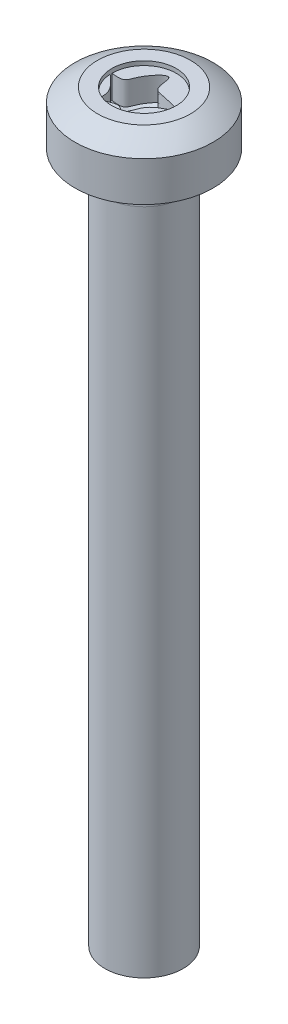
ISO-10303-21;
HEADER;
FILE_DESCRIPTION(('STEP AP214'),'2;1');
FILE_NAME('part.step','',(''),(''),'','','');
FILE_SCHEMA(('AUTOMOTIVE_DESIGN { 1 0 10303 214 1 1 1 1 }'));
ENDSEC;
DATA;
#1=APPLICATION_CONTEXT('core data for automotive mechanical design processes');
#2=APPLICATION_PROTOCOL_DEFINITION('international standard','automotive_design',2000,#1);
#3=PRODUCT_CONTEXT('',#1,'mechanical');
#4=PRODUCT('Part','Part','',(#3));
#5=PRODUCT_RELATED_PRODUCT_CATEGORY('part','',(#4));
#6=PRODUCT_DEFINITION_FORMATION('','',#4);
#7=PRODUCT_DEFINITION_CONTEXT('part definition',#1,'design');
#8=PRODUCT_DEFINITION('design','',#6,#7);
#9=PRODUCT_DEFINITION_SHAPE('','',#8);
#10=(LENGTH_UNIT() NAMED_UNIT(*) SI_UNIT(.MILLI.,.METRE.));
#11=(NAMED_UNIT(*) PLANE_ANGLE_UNIT() SI_UNIT($,.RADIAN.));
#12=(NAMED_UNIT(*) SI_UNIT($,.STERADIAN.) SOLID_ANGLE_UNIT());
#13=UNCERTAINTY_MEASURE_WITH_UNIT(LENGTH_MEASURE(1.E-05),#10,'distance_accuracy_value','');
#14=(GEOMETRIC_REPRESENTATION_CONTEXT(3) GLOBAL_UNCERTAINTY_ASSIGNED_CONTEXT((#13)) GLOBAL_UNIT_ASSIGNED_CONTEXT((#10,
#11,#12)) REPRESENTATION_CONTEXT('',''));
#15=CARTESIAN_POINT('',(0.,0.,0.));
#16=DIRECTION('',(0.,0.,1.));
#17=DIRECTION('',(1.,0.,0.));
#18=AXIS2_PLACEMENT_3D('',#15,#16,#17);
#19=CARTESIAN_POINT('',(-1.39999999999999,62.18,2.42487113059644));
#20=CARTESIAN_POINT('',(-1.5139381572588,62.18,2.3235132192626));
#21=CARTESIAN_POINT('',(-1.29170822303761,62.18,1.05295212978515));
#22=CARTESIAN_POINT('',(-3.73833187546397,62.18,-0.274960193560339));
#23=CARTESIAN_POINT('',(-1.67099433066138,62.18,0.199786237296184));
#24=CARTESIAN_POINT('',(-1.41411817189211,62.18,-1.10647326313669));
#25=CARTESIAN_POINT('',(0.315407203800822,62.18,-3.11761619265361));
#26=CARTESIAN_POINT('',(0.0837874095126002,62.18,-0.75025211345907));
#27=CARTESIAN_POINT('',(1.36584469991785,62.18,-0.443842910863704));
#28=CARTESIAN_POINT('',(3.87744334290299,62.18,-0.00947150733040625));
#29=CARTESIAN_POINT('',(0.884751101149698,62.18,0.553386810394968));
#30=CARTESIAN_POINT('',(0.772921937425964,62.18,2.87320554200612));
#31=CARTESIAN_POINT('',(-0.230343949042386,62.18,1.7651287133654));
#32=CARTESIAN_POINT('',(-1.20531990620942,62.18,2.59805602457418));
#33=CARTESIAN_POINT('',(-1.39999999999999,62.18,2.42487113059644));
#34=B_SPLINE_CURVE_WITH_KNOTS('',3,(#19,#20,#21,#22,#23,#24,#25,#26,#27,#28,#29,#30,#31,#32,
#33),.UNSPECIFIED.,.T.,.F.,(4,1,1,1,1,1,1,1,1,1,1,1,4),(0.,0.0521767829464946,0.179018134340515,
0.237467971194127,0.292040127813916,0.415648105214969,0.507114760558173,0.541693415808289,
0.662364745757282,0.780125533467327,0.878673094989427,0.910848294881233,1.),.UNSPECIFIED.);
#35=DIRECTION('',(0.,1.,0.));
#36=VECTOR('',#35,1.);
#37=SURFACE_OF_LINEAR_EXTRUSION('',#34,#36);
#38=DIRECTION('',(0.,1.,0.));
#39=VECTOR('',#38,1.);
#40=CARTESIAN_POINT('',(-2.79637866927082,62.18,0.142359889179433));
#41=LINE('',#40,#39);
#42=CARTESIAN_POINT('',(-2.79637866927082,62.18,0.142359889179433));
#43=VERTEX_POINT('',#42);
#44=CARTESIAN_POINT('',(-2.79637866927082,64.237,0.142359889179433));
#45=VERTEX_POINT('',#44);
#46=EDGE_CURVE('E146',#43,#45,#41,.T.);
#47=ORIENTED_EDGE('',*,*,#46,.T.);
#48=CARTESIAN_POINT('',(-1.39999999999999,64.237,2.42487113059644));
#49=CARTESIAN_POINT('',(-1.5139381572588,64.237,2.3235132192626));
#50=CARTESIAN_POINT('',(-1.29170822303761,64.237,1.05295212978515));
#51=CARTESIAN_POINT('',(-3.73833187546397,64.237,-0.274960193560339));
#52=CARTESIAN_POINT('',(-1.67099433066138,64.237,0.199786237296184));
#53=CARTESIAN_POINT('',(-1.41411817189211,64.237,-1.10647326313669));
#54=CARTESIAN_POINT('',(0.315407203800822,64.237,-3.11761619265361));
#55=CARTESIAN_POINT('',(0.0837874095126002,64.237,-0.75025211345907));
#56=CARTESIAN_POINT('',(1.36584469991785,64.237,-0.443842910863704));
#57=CARTESIAN_POINT('',(3.87744334290299,64.237,-0.00947150733040625));
#58=CARTESIAN_POINT('',(0.884751101149698,64.237,0.553386810394968));
#59=CARTESIAN_POINT('',(0.772921937425964,64.237,2.87320554200612));
#60=CARTESIAN_POINT('',(-0.230343949042386,64.237,1.7651287133654));
#61=CARTESIAN_POINT('',(-1.20531990620942,64.237,2.59805602457418));
#62=CARTESIAN_POINT('',(-1.39999999999999,64.237,2.42487113059644));
#63=B_SPLINE_CURVE_WITH_KNOTS('',3,(#48,#49,#50,#51,#52,#53,#54,#55,#56,#57,#58,#59,#60,#61,
#62),.UNSPECIFIED.,.T.,.F.,(4,1,1,1,1,1,1,1,1,1,1,1,4),(0.,0.0521767829464946,0.179018134340515,
0.237467971194127,0.292040127813916,0.415648105214969,0.507114760558173,0.541693415808289,
0.662364745757282,0.780125533467327,0.878673094989427,0.910848294881233,1.),.UNSPECIFIED.);
#64=CARTESIAN_POINT('',(-1.39999999999999,64.237,2.42487113059644));
#65=VERTEX_POINT('',#64);
#66=EDGE_CURVE('E126',#45,#65,#63,.F.);
#67=ORIENTED_EDGE('',*,*,#66,.T.);
#68=DIRECTION('',(0.,1.,0.));
#69=VECTOR('',#68,1.);
#70=CARTESIAN_POINT('',(-1.39999999999999,62.18,2.42487113059644));
#71=LINE('',#70,#69);
#72=CARTESIAN_POINT('',(-1.39999999999999,62.18,2.42487113059644));
#73=VERTEX_POINT('',#72);
#74=EDGE_CURVE('E155',#73,#65,#71,.T.);
#75=ORIENTED_EDGE('',*,*,#74,.F.);
#76=CARTESIAN_POINT('',(-1.6622215113609,62.18,1.36969810600984));
#77=VERTEX_POINT('',#76);
#78=EDGE_CURVE('E233',#73,#77,#34,.T.);
#79=ORIENTED_EDGE('',*,*,#78,.T.);
#80=CARTESIAN_POINT('',(-1.8851960611322,62.18,1.04167608474492));
#81=VERTEX_POINT('',#80);
#82=EDGE_CURVE('E239',#77,#81,#34,.T.);
#83=ORIENTED_EDGE('',*,*,#82,.T.);
#84=EDGE_CURVE('E194',#81,#43,#34,.T.);
#85=ORIENTED_EDGE('',*,*,#84,.T.);
#86=EDGE_LOOP('',(#47,#67,#75,#79,#83,#85));
#87=FACE_BOUND('',#86,.T.);
#88=ADVANCED_FACE('F35',(#87),#37,.T.);
#89=DIRECTION('',(0.,1.,0.));
#90=VECTOR('',#89,1.);
#91=CARTESIAN_POINT('',(2.8,62.18,0.));
#92=LINE('',#91,#90);
#93=CARTESIAN_POINT('',(2.8,62.18,0.));
#94=VERTEX_POINT('',#93);
#95=CARTESIAN_POINT('',(2.8,64.237,0.));
#96=VERTEX_POINT('',#95);
#97=EDGE_CURVE('E134',#94,#96,#92,.T.);
#98=ORIENTED_EDGE('',*,*,#97,.T.);
#99=CARTESIAN_POINT('',(-1.39999999999999,64.237,2.42487113059644));
#100=CARTESIAN_POINT('',(-1.5139381572588,64.237,2.3235132192626));
#101=CARTESIAN_POINT('',(-1.29170822303761,64.237,1.05295212978515));
#102=CARTESIAN_POINT('',(-3.73833187546397,64.237,-0.274960193560339));
#103=CARTESIAN_POINT('',(-1.67099433066138,64.237,0.199786237296184));
#104=CARTESIAN_POINT('',(-1.41411817189211,64.237,-1.10647326313669));
#105=CARTESIAN_POINT('',(0.315407203800822,64.237,-3.11761619265361));
#106=CARTESIAN_POINT('',(0.0837874095126002,64.237,-0.75025211345907));
#107=CARTESIAN_POINT('',(1.36584469991785,64.237,-0.443842910863704));
#108=CARTESIAN_POINT('',(3.87744334290299,64.237,-0.00947150733040625));
#109=CARTESIAN_POINT('',(0.884751101149698,64.237,0.553386810394968));
#110=CARTESIAN_POINT('',(0.772921937425964,64.237,2.87320554200612));
#111=CARTESIAN_POINT('',(-0.230343949042386,64.237,1.7651287133654));
#112=CARTESIAN_POINT('',(-1.20531990620942,64.237,2.59805602457418));
#113=CARTESIAN_POINT('',(-1.39999999999999,64.237,2.42487113059644));
#114=B_SPLINE_CURVE_WITH_KNOTS('',3,(#99,#100,#101,#102,#103,#104,#105,#106,#107,#108,#109,#110,
#111,#112,#113),.UNSPECIFIED.,.T.,.F.,(4,1,1,1,1,1,1,1,1,1,1,1,4),(0.,0.0521767829464946,
0.179018134340515,0.237467971194127,0.292040127813916,0.415648105214969,0.507114760558173,
0.541693415808289,0.662364745757282,0.780125533467327,0.878673094989427,0.910848294881233,1.),.UNSPECIFIED.);
#115=CARTESIAN_POINT('',(-2.8,64.237,0.));
#116=VERTEX_POINT('',#115);
#117=EDGE_CURVE('E121',#96,#116,#114,.F.);
#118=ORIENTED_EDGE('',*,*,#117,.T.);
#119=DIRECTION('',(0.,1.,0.));
#120=VECTOR('',#119,1.);
#121=CARTESIAN_POINT('',(-2.8,62.18,0.));
#122=LINE('',#121,#120);
#123=CARTESIAN_POINT('',(-2.8,62.18,0.));
#124=VERTEX_POINT('',#123);
#125=EDGE_CURVE('E137',#124,#116,#122,.T.);
#126=ORIENTED_EDGE('',*,*,#125,.F.);
#127=CARTESIAN_POINT('',(-2.15364801946993,62.18,0.0292140834378174));
#128=VERTEX_POINT('',#127);
#129=EDGE_CURVE('E491',#124,#128,#34,.T.);
#130=ORIENTED_EDGE('',*,*,#129,.T.);
#131=CARTESIAN_POINT('',(-0.348861366704687,62.18,-2.12540560864481));
#132=VERTEX_POINT('',#131);
#133=EDGE_CURVE('E492',#128,#132,#34,.T.);
#134=ORIENTED_EDGE('',*,*,#133,.T.);
#135=CARTESIAN_POINT('',(0.,62.18,-2.15384615384615));
#136=VERTEX_POINT('',#135);
#137=EDGE_CURVE('E494',#132,#136,#34,.T.);
#138=ORIENTED_EDGE('',*,*,#137,.T.);
#139=CARTESIAN_POINT('',(2.13401603917006,62.18,-0.291596980441815));
#140=VERTEX_POINT('',#139);
#141=EDGE_CURVE('E510',#136,#140,#34,.T.);
#142=ORIENTED_EDGE('',*,*,#141,.T.);
#143=EDGE_CURVE('E143',#140,#94,#34,.T.);
#144=ORIENTED_EDGE('',*,*,#143,.T.);
#145=EDGE_LOOP('',(#98,#118,#126,#130,#134,#138,#142,#144));
#146=FACE_BOUND('',#145,.T.);
#147=ADVANCED_FACE('F140',(#146),#37,.T.);
#148=DIRECTION('',(0.,1.,0.));
#149=VECTOR('',#148,1.);
#150=CARTESIAN_POINT('',(-1.35910016824837,62.18,2.44802915274047));
#151=LINE('',#150,#149);
#152=CARTESIAN_POINT('',(-1.35910016824837,62.18,2.44802915274047));
#153=VERTEX_POINT('',#152);
#154=CARTESIAN_POINT('',(-1.35910016824837,64.237,2.44802915274047));
#155=VERTEX_POINT('',#154);
#156=EDGE_CURVE('E149',#153,#155,#151,.T.);
#157=ORIENTED_EDGE('',*,*,#156,.T.);
#158=CARTESIAN_POINT('',(-1.39999999999999,64.237,2.42487113059644));
#159=CARTESIAN_POINT('',(-1.5139381572588,64.237,2.3235132192626));
#160=CARTESIAN_POINT('',(-1.29170822303761,64.237,1.05295212978515));
#161=CARTESIAN_POINT('',(-3.73833187546397,64.237,-0.274960193560339));
#162=CARTESIAN_POINT('',(-1.67099433066138,64.237,0.199786237296184));
#163=CARTESIAN_POINT('',(-1.41411817189211,64.237,-1.10647326313669));
#164=CARTESIAN_POINT('',(0.315407203800822,64.237,-3.11761619265361));
#165=CARTESIAN_POINT('',(0.0837874095126002,64.237,-0.75025211345907));
#166=CARTESIAN_POINT('',(1.36584469991785,64.237,-0.443842910863704));
#167=CARTESIAN_POINT('',(3.87744334290299,64.237,-0.00947150733040625));
#168=CARTESIAN_POINT('',(0.884751101149698,64.237,0.553386810394968));
#169=CARTESIAN_POINT('',(0.772921937425964,64.237,2.87320554200612));
#170=CARTESIAN_POINT('',(-0.230343949042386,64.237,1.7651287133654));
#171=CARTESIAN_POINT('',(-1.20531990620942,64.237,2.59805602457418));
#172=CARTESIAN_POINT('',(-1.39999999999999,64.237,2.42487113059644));
#173=B_SPLINE_CURVE_WITH_KNOTS('',3,(#158,#159,#160,#161,#162,#163,#164,#165,#166,#167,#168,
#169,#170,#171,#172),.UNSPECIFIED.,.T.,.F.,(4,1,1,1,1,1,1,1,1,1,1,1,4),(0.,0.0521767829464946,
0.179018134340515,0.237467971194127,0.292040127813916,0.415648105214969,0.507114760558173,
0.541693415808289,0.662364745757282,0.780125533467327,0.878673094989427,0.910848294881233,1.),.UNSPECIFIED.);
#174=CARTESIAN_POINT('',(2.79999813434305,64.237,0.00323228640824209));
#175=VERTEX_POINT('',#174);
#176=EDGE_CURVE('E127',#155,#175,#173,.F.);
#177=ORIENTED_EDGE('',*,*,#176,.T.);
#178=DIRECTION('',(0.,1.,0.));
#179=VECTOR('',#178,1.);
#180=CARTESIAN_POINT('',(2.79999813434305,62.18,0.00323228640824209));
#181=LINE('',#180,#179);
#182=CARTESIAN_POINT('',(2.79999813434305,62.18,0.00323228640824209));
#183=VERTEX_POINT('',#182);
#184=EDGE_CURVE('E144',#183,#175,#181,.T.);
#185=ORIENTED_EDGE('',*,*,#184,.F.);
#186=CARTESIAN_POINT('',(2.11552762796309,62.18,0.404470159298225));
#187=VERTEX_POINT('',#186);
#188=EDGE_CURVE('E240',#183,#187,#34,.T.);
#189=ORIENTED_EDGE('',*,*,#188,.T.);
#190=CARTESIAN_POINT('',(0.832151168927636,62.18,1.98659952846321));
#191=VERTEX_POINT('',#190);
#192=EDGE_CURVE('E489',#187,#191,#34,.T.);
#193=ORIENTED_EDGE('',*,*,#192,.T.);
#194=CARTESIAN_POINT('',(0.,62.18,2.15384615384615));
#195=VERTEX_POINT('',#194);
#196=EDGE_CURVE('E498',#191,#195,#34,.T.);
#197=ORIENTED_EDGE('',*,*,#196,.T.);
#198=CARTESIAN_POINT('',(-0.302543139241223,62.18,2.13249171237216));
#199=VERTEX_POINT('',#198);
#200=EDGE_CURVE('E500',#195,#199,#34,.T.);
#201=ORIENTED_EDGE('',*,*,#200,.T.);
#202=EDGE_CURVE('E232',#199,#153,#34,.T.);
#203=ORIENTED_EDGE('',*,*,#202,.T.);
#204=EDGE_LOOP('',(#157,#177,#185,#189,#193,#197,#201,#203));
#205=FACE_BOUND('',#204,.T.);
#206=ADVANCED_FACE('F248',(#205),#37,.T.);
#207=CARTESIAN_POINT('',(0.,62.18,0.));
#208=DIRECTION('',(0.,1.,0.));
#209=DIRECTION('',(0.,0.,1.));
#210=AXIS2_PLACEMENT_3D('',#207,#208,#209);
#211=PLANE('',#210);
#212=ORIENTED_EDGE('',*,*,#143,.F.);
#213=CARTESIAN_POINT('',(0.,62.18,0.));
#214=DIRECTION('',(0.,-1.,0.));
#215=DIRECTION('',(0.,0.,-1.));
#216=AXIS2_PLACEMENT_3D('',#213,#214,#215);
#217=CIRCLE('',#216,2.15384615384615);
#218=EDGE_CURVE('E11',#140,#187,#217,.T.);
#219=ORIENTED_EDGE('',*,*,#218,.T.);
#220=ORIENTED_EDGE('',*,*,#188,.F.);
#221=CARTESIAN_POINT('',(0.,62.18,0.));
#222=DIRECTION('',(0.,1.,0.));
#223=DIRECTION('',(0.,0.,1.));
#224=AXIS2_PLACEMENT_3D('',#221,#222,#223);
#225=CIRCLE('',#224,2.8);
#226=EDGE_CURVE('E234',#183,#94,#225,.T.);
#227=ORIENTED_EDGE('',*,*,#226,.T.);
#228=EDGE_LOOP('',(#212,#219,#220,#227));
#229=FACE_BOUND('',#228,.T.);
#230=ADVANCED_FACE('F322',(#229),#211,.T.);
#231=ORIENTED_EDGE('',*,*,#196,.F.);
#232=EDGE_CURVE('E44',#191,#195,#217,.T.);
#233=ORIENTED_EDGE('',*,*,#232,.T.);
#234=EDGE_LOOP('',(#231,#233));
#235=FACE_BOUND('',#234,.T.);
#236=ADVANCED_FACE('F336',(#235),#211,.T.);
#237=ORIENTED_EDGE('',*,*,#202,.F.);
#238=EDGE_CURVE('E185',#199,#77,#217,.T.);
#239=ORIENTED_EDGE('',*,*,#238,.T.);
#240=ORIENTED_EDGE('',*,*,#78,.F.);
#241=EDGE_CURVE('E230',#73,#153,#225,.T.);
#242=ORIENTED_EDGE('',*,*,#241,.T.);
#243=EDGE_LOOP('',(#237,#239,#240,#242));
#244=FACE_BOUND('',#243,.T.);
#245=ADVANCED_FACE('F329',(#244),#211,.T.);
#246=ORIENTED_EDGE('',*,*,#84,.F.);
#247=EDGE_CURVE('E179',#81,#128,#217,.T.);
#248=ORIENTED_EDGE('',*,*,#247,.T.);
#249=ORIENTED_EDGE('',*,*,#129,.F.);
#250=EDGE_CURVE('E158',#124,#43,#225,.T.);
#251=ORIENTED_EDGE('',*,*,#250,.T.);
#252=EDGE_LOOP('',(#246,#248,#249,#251));
#253=FACE_BOUND('',#252,.T.);
#254=ADVANCED_FACE('F321',(#253),#211,.T.);
#255=ORIENTED_EDGE('',*,*,#137,.F.);
#256=EDGE_CURVE('E175',#132,#136,#217,.T.);
#257=ORIENTED_EDGE('',*,*,#256,.T.);
#258=EDGE_LOOP('',(#255,#257));
#259=FACE_BOUND('',#258,.T.);
#260=ADVANCED_FACE('F267',(#259),#211,.T.);
#261=CARTESIAN_POINT('',(6.,64.6,0.));
#262=DIRECTION('',(0.,1.,0.));
#263=DIRECTION('',(0.,0.,1.));
#264=AXIS2_PLACEMENT_3D('',#261,#262,#263);
#265=PLANE('',#264);
#266=CARTESIAN_POINT('',(0.,64.6,0.));
#267=DIRECTION('',(0.,1.,0.));
#268=DIRECTION('',(0.,0.,1.));
#269=AXIS2_PLACEMENT_3D('',#266,#267,#268);
#270=CIRCLE('',#269,2.8);
#271=CARTESIAN_POINT('',(0.,64.6,2.8));
#272=VERTEX_POINT('',#271);
#273=EDGE_CURVE('E189',#272,#272,#270,.T.);
#274=ORIENTED_EDGE('',*,*,#273,.F.);
#275=EDGE_LOOP('',(#274));
#276=FACE_BOUND('',#275,.T.);
#277=CARTESIAN_POINT('',(0.,64.6,0.));
#278=DIRECTION('',(0.,1.,0.));
#279=DIRECTION('',(0.,0.,1.));
#280=AXIS2_PLACEMENT_3D('',#277,#278,#279);
#281=CIRCLE('',#280,4.03453838747385);
#282=CARTESIAN_POINT('',(4.03453838747386,64.6,0.));
#283=VERTEX_POINT('',#282);
#284=EDGE_CURVE('E39',#283,#283,#281,.T.);
#285=ORIENTED_EDGE('',*,*,#284,.T.);
#286=EDGE_LOOP('',(#285));
#287=FACE_BOUND('',#286,.T.);
#288=ADVANCED_FACE('F263',(#276,#287),#265,.T.);
#289=CARTESIAN_POINT('',(0.,0.,0.));
#290=DIRECTION('',(0.,-1.,0.));
#291=DIRECTION('',(0.,0.,-1.));
#292=AXIS2_PLACEMENT_3D('',#289,#290,#291);
#293=CYLINDRICAL_SURFACE('',#292,6.);
#294=CARTESIAN_POINT('',(0.,60.,0.));
#295=DIRECTION('',(0.,-1.,0.));
#296=DIRECTION('',(0.,0.,-1.));
#297=AXIS2_PLACEMENT_3D('',#294,#295,#296);
#298=CIRCLE('',#297,6.);
#299=CARTESIAN_POINT('',(0.,60.,-6.));
#300=VERTEX_POINT('',#299);
#301=EDGE_CURVE('E171',#300,#300,#298,.T.);
#302=ORIENTED_EDGE('',*,*,#301,.F.);
#303=EDGE_LOOP('',(#302));
#304=FACE_BOUND('',#303,.T.);
#305=CARTESIAN_POINT('',(0.,63.45,0.));
#306=DIRECTION('',(0.,-1.,0.));
#307=DIRECTION('',(0.,0.,-1.));
#308=AXIS2_PLACEMENT_3D('',#305,#306,#307);
#309=CIRCLE('',#308,6.);
#310=CARTESIAN_POINT('',(6.,63.45,0.));
#311=VERTEX_POINT('',#310);
#312=EDGE_CURVE('E168',#311,#311,#309,.T.);
#313=ORIENTED_EDGE('',*,*,#312,.T.);
#314=EDGE_LOOP('',(#313));
#315=FACE_BOUND('',#314,.T.);
#316=ADVANCED_FACE('F266',(#304,#315),#293,.T.);
#317=CARTESIAN_POINT('',(3.4,60.,0.));
#318=DIRECTION('',(0.,-1.,0.));
#319=DIRECTION('',(0.,0.,-1.));
#320=AXIS2_PLACEMENT_3D('',#317,#318,#319);
#321=PLANE('',#320);
#322=ORIENTED_EDGE('',*,*,#301,.T.);
#323=EDGE_LOOP('',(#322));
#324=FACE_BOUND('',#323,.T.);
#325=CARTESIAN_POINT('',(0.,60.,0.));
#326=DIRECTION('',(0.,-1.,0.));
#327=DIRECTION('',(0.,0.,-1.));
#328=AXIS2_PLACEMENT_3D('',#325,#326,#327);
#329=CIRCLE('',#328,3.4);
#330=CARTESIAN_POINT('',(0.,60.,-3.4));
#331=VERTEX_POINT('',#330);
#332=EDGE_CURVE('E159',#331,#331,#329,.T.);
#333=ORIENTED_EDGE('',*,*,#332,.F.);
#334=EDGE_LOOP('',(#333));
#335=FACE_BOUND('',#334,.T.);
#336=ADVANCED_FACE('F261',(#324,#335),#321,.T.);
#337=CARTESIAN_POINT('',(0.,55.45,0.));
#338=DIRECTION('',(0.,-1.,0.));
#339=DIRECTION('',(1.,0.,0.));
#340=AXIS2_PLACEMENT_3D('',#337,#338,#339);
#341=SPHERICAL_SURFACE('',#340,10.);
#342=CARTESIAN_POINT('',(6.,63.45,0.));
#343=CARTESIAN_POINT('',(5.98098227569635,63.464263295163,0.));
#344=CARTESIAN_POINT('',(5.96191368919514,63.4784587740307,0.));
#345=CARTESIAN_POINT('',(5.92367576567049,63.5067133826603,0.));
#346=CARTESIAN_POINT('',(5.90450642864706,63.5207725124221,0.));
#347=CARTESIAN_POINT('',(5.8660679779509,63.5487537063247,0.));
#348=CARTESIAN_POINT('',(5.84679886427817,63.5626757704655,0.));
#349=CARTESIAN_POINT('',(5.80816184060403,63.5903821254399,0.));
#350=CARTESIAN_POINT('',(5.78879393060262,63.6041664162736,0.));
#351=CARTESIAN_POINT('',(5.7499602992486,63.6315965234574,0.));
#352=CARTESIAN_POINT('',(5.730494577896,63.6452423398075,0.));
#353=CARTESIAN_POINT('',(5.6914663138904,63.6723948040236,0.));
#354=CARTESIAN_POINT('',(5.6719037712374,63.6859014518896,0.));
#355=CARTESIAN_POINT('',(5.63268285957971,63.7127748921797,0.));
#356=CARTESIAN_POINT('',(5.61302449057502,63.7261416846037,0.));
#357=CARTESIAN_POINT('',(5.5736129260435,63.7527347341743,0.));
#358=CARTESIAN_POINT('',(5.55385973051667,63.7659609913209,0.));
#359=CARTESIAN_POINT('',(5.51425951759139,63.7922722976465,0.));
#360=CARTESIAN_POINT('',(5.49441250019295,63.8053573468254,0.));
#361=CARTESIAN_POINT('',(5.4546256529473,63.831385571708,0.));
#362=CARTESIAN_POINT('',(5.43468582310009,63.8443287474116,0.));
#363=CARTESIAN_POINT('',(5.39471436510008,63.8700725670513,0.));
#364=CARTESIAN_POINT('',(5.37468273694726,63.8828732109873,0.));
#365=CARTESIAN_POINT('',(5.33452870114811,63.9083313160489,0.));
#366=CARTESIAN_POINT('',(5.31440629350177,63.9209887771744,0.));
#367=CARTESIAN_POINT('',(5.27407172214469,63.9461598728543,0.));
#368=CARTESIAN_POINT('',(5.25385955843395,63.9586735074087,0.));
#369=CARTESIAN_POINT('',(5.21334650294221,63.9835563135006,0.));
#370=CARTESIAN_POINT('',(5.19304561116121,63.9959254850382,0.));
#371=CARTESIAN_POINT('',(5.15235613203581,64.0205187359984,0.));
#372=CARTESIAN_POINT('',(5.13196754469141,64.032742815421,0.));
#373=CARTESIAN_POINT('',(5.09110371140629,64.0570452604323,0.));
#374=CARTESIAN_POINT('',(5.07062846546557,64.0691236260212,0.));
#375=CARTESIAN_POINT('',(5.02959235636236,64.0931340290573,0.));
#376=CARTESIAN_POINT('',(5.00903149319986,64.1050660665045,0.));
#377=CARTESIAN_POINT('',(4.96782519538215,64.128783206392,0.));
#378=CARTESIAN_POINT('',(4.94717976072693,64.1405683088323,0.));
#379=CARTESIAN_POINT('',(4.90580536995414,64.1639909793134,0.));
#380=CARTESIAN_POINT('',(4.88507641383657,64.1756285473543,0.));
#381=CARTESIAN_POINT('',(4.84353603441738,64.1987555571479,0.));
#382=CARTESIAN_POINT('',(4.82272461111575,64.2102449989007,0.));
#383=CARTESIAN_POINT('',(4.78102035580102,64.2330751717631,0.));
#384=CARTESIAN_POINT('',(4.76012752378792,64.2444159028728,0.));
#385=CARTESIAN_POINT('',(4.7182615136633,64.2669480776576,0.));
#386=CARTESIAN_POINT('',(4.69728833555176,64.2781395213326,0.));
#387=CARTESIAN_POINT('',(4.65526269992974,64.3003725520494,0.));
#388=CARTESIAN_POINT('',(4.63421024241924,64.311414139091,0.));
#389=CARTESIAN_POINT('',(4.59202711873092,64.333346894964,0.));
#390=CARTESIAN_POINT('',(4.5708964525531,64.3442380637952,0.));
#391=CARTESIAN_POINT('',(4.52855798623939,64.3658694293205,0.));
#392=CARTESIAN_POINT('',(4.5073501861035,64.3766096260145,0.));
#393=CARTESIAN_POINT('',(4.46485853050632,64.3979385010176,0.));
#394=CARTESIAN_POINT('',(4.44357467504503,64.4085271793267,0.));
#395=CARTESIAN_POINT('',(4.40093199129656,64.4295524790157,0.));
#396=CARTESIAN_POINT('',(4.37957316300939,64.4399891003956,0.));
#397=CARTESIAN_POINT('',(4.33678161992673,64.4607097554263,0.));
#398=CARTESIAN_POINT('',(4.31534890513123,64.4709937890771,0.));
#399=CARTESIAN_POINT('',(4.27241067908911,64.4914087455701,0.));
#400=CARTESIAN_POINT('',(4.2509051678425,64.5015396684122,0.));
#401=CARTESIAN_POINT('',(4.2078224427258,64.5216478881466,0.));
#402=CARTESIAN_POINT('',(4.18624522885571,64.5316251850388,0.));
#403=CARTESIAN_POINT('',(4.14302019571273,64.5514256449811,0.));
#404=CARTESIAN_POINT('',(4.12137237643984,64.5612488080311,0.));
#405=CARTESIAN_POINT('',(4.07800723425011,64.580740502343,0.));
#406=CARTESIAN_POINT('',(4.05628991133326,64.590409033605,0.));
#407=CARTESIAN_POINT('',(4.03453838747386,64.6,0.));
#408=B_SPLINE_CURVE_WITH_KNOTS('',3,(#342,#343,#344,#345,#346,#347,#348,#349,#350,#351,#352,
#353,#354,#355,#356,#357,#358,#359,#360,#361,#362,#363,#364,#365,#366,#367,#368,#369,#370,#371,
#372,#373,#374,#375,#376,#377,#378,#379,#380,#381,#382,#383,#384,#385,#386,#387,#388,#389,#390,
#391,#392,#393,#394,#395,#396,#397,#398,#399,#400,#401,#402,#403,#404,#405,#406,#407),
.UNSPECIFIED.,.F.,.F.,(4,2,2,2,2,2,2,2,2,2,2,2,2,2,2,2,2,2,2,2,2,2,2,2,2,2,2,2,2,2,2,2,4),(0.,
0.0713163184575103,0.142632636915027,0.213948955372548,0.285265273830062,0.356581592287579,
0.427897910745093,0.499214229202615,0.570530547660129,0.641846866117642,0.713163184575163,
0.784479503032677,0.855795821490193,0.927112139947714,0.998428458405227,1.06974477686274,
1.14106109532026,1.21237741377778,1.28369373223529,1.35501005069281,1.42632636915032,
1.49764268760784,1.56895900606536,1.64027532452288,1.71159164298039,1.78290796143791,
1.85422427989542,1.92554059835294,1.99685691681046,2.06817323526797,2.13948955372549,
2.21080587218301,2.28212219064052),.UNSPECIFIED.);
#409=EDGE_CURVE('BSEAM257',#311,#283,#408,.T.);
#410=ORIENTED_EDGE('',*,*,#312,.F.);
#411=ORIENTED_EDGE('',*,*,#284,.F.);
#412=ORIENTED_EDGE('',*,*,#409,.T.);
#413=ORIENTED_EDGE('',*,*,#409,.F.);
#414=EDGE_LOOP('',(#410,#412,#411,#413));
#415=FACE_BOUND('',#414,.T.);
#416=ADVANCED_FACE('F257',(#415),#341,.T.);
#417=CARTESIAN_POINT('',(0.,58.,0.));
#418=DIRECTION('',(0.,-1.,0.));
#419=DIRECTION('',(0.,0.,-1.));
#420=AXIS2_PLACEMENT_3D('',#417,#418,#419);
#421=CONICAL_SURFACE('',#420,3.4,0.0846521919220758);
#422=CARTESIAN_POINT('',(0.,59.75,0.));
#423=DIRECTION('',(0.,-1.,0.));
#424=DIRECTION('',(0.,0.,-1.));
#425=AXIS2_PLACEMENT_3D('',#422,#423,#424);
#426=CIRCLE('',#425,3.25150378692776);
#427=CARTESIAN_POINT('',(0.,59.75,-3.25150378692776));
#428=VERTEX_POINT('',#427);
#429=EDGE_CURVE('E162',#428,#428,#426,.T.);
#430=ORIENTED_EDGE('',*,*,#429,.T.);
#431=EDGE_LOOP('',(#430));
#432=FACE_BOUND('',#431,.T.);
#433=CARTESIAN_POINT('',(0.,58.,0.));
#434=DIRECTION('',(0.,-1.,0.));
#435=DIRECTION('',(0.,0.,-1.));
#436=AXIS2_PLACEMENT_3D('',#433,#434,#435);
#437=CIRCLE('',#436,3.4);
#438=CARTESIAN_POINT('',(0.,58.,-3.4));
#439=VERTEX_POINT('',#438);
#440=EDGE_CURVE('E165',#439,#439,#437,.T.);
#441=ORIENTED_EDGE('',*,*,#440,.F.);
#442=EDGE_LOOP('',(#441));
#443=FACE_BOUND('',#442,.T.);
#444=ADVANCED_FACE('F253',(#432,#443),#421,.T.);
#445=CARTESIAN_POINT('',(0.,59.7711377813242,0.));
#446=DIRECTION('',(0.,-1.,0.));
#447=DIRECTION('',(0.,0.,-1.));
#448=AXIS2_PLACEMENT_3D('',#445,#446,#447);
#449=TOROIDAL_SURFACE('',#448,3.50060857251144,0.250000000000001);
#450=ORIENTED_EDGE('',*,*,#332,.T.);
#451=EDGE_LOOP('',(#450));
#452=FACE_BOUND('',#451,.T.);
#453=ORIENTED_EDGE('',*,*,#429,.F.);
#454=EDGE_LOOP('',(#453));
#455=FACE_BOUND('',#454,.T.);
#456=ADVANCED_FACE('F250',(#452,#455),#449,.F.);
#457=CARTESIAN_POINT('',(0.,0.,0.));
#458=DIRECTION('',(0.,-1.,0.));
#459=DIRECTION('',(0.,0.,-1.));
#460=AXIS2_PLACEMENT_3D('',#457,#458,#459);
#461=PLANE('',#460);
#462=CARTESIAN_POINT('',(0.,0.,0.));
#463=DIRECTION('',(0.,-1.,0.));
#464=DIRECTION('',(0.,0.,-1.));
#465=AXIS2_PLACEMENT_3D('',#462,#463,#464);
#466=CIRCLE('',#465,3.4);
#467=CARTESIAN_POINT('',(0.,0.,-3.4));
#468=VERTEX_POINT('',#467);
#469=EDGE_CURVE('E173',#468,#468,#466,.T.);
#470=ORIENTED_EDGE('',*,*,#469,.T.);
#471=EDGE_LOOP('',(#470));
#472=FACE_BOUND('',#471,.T.);
#473=ADVANCED_FACE('F37',(#472),#461,.T.);
#474=CARTESIAN_POINT('',(0.,0.,0.));
#475=DIRECTION('',(0.,-1.,0.));
#476=DIRECTION('',(0.,0.,-1.));
#477=AXIS2_PLACEMENT_3D('',#474,#475,#476);
#478=CYLINDRICAL_SURFACE('',#477,3.4);
#479=ORIENTED_EDGE('',*,*,#469,.F.);
#480=EDGE_LOOP('',(#479));
#481=FACE_BOUND('',#480,.T.);
#482=ORIENTED_EDGE('',*,*,#440,.T.);
#483=EDGE_LOOP('',(#482));
#484=FACE_BOUND('',#483,.T.);
#485=ADVANCED_FACE('F274',(#481,#484),#478,.T.);
#486=CARTESIAN_POINT('',(0.,62.18,0.));
#487=DIRECTION('',(0.,1.,0.));
#488=DIRECTION('',(0.,0.,1.));
#489=AXIS2_PLACEMENT_3D('',#486,#487,#488);
#490=CYLINDRICAL_SURFACE('',#489,2.8);
#491=ORIENTED_EDGE('',*,*,#273,.T.);
#492=EDGE_LOOP('',(#491));
#493=FACE_BOUND('',#492,.T.);
#494=CARTESIAN_POINT('',(0.,64.237,0.));
#495=DIRECTION('',(0.,1.,0.));
#496=DIRECTION('',(0.,0.,1.));
#497=AXIS2_PLACEMENT_3D('',#494,#495,#496);
#498=CIRCLE('',#497,2.8);
#499=EDGE_CURVE('E138',#45,#65,#498,.T.);
#500=ORIENTED_EDGE('',*,*,#499,.F.);
#501=ORIENTED_EDGE('',*,*,#46,.F.);
#502=ORIENTED_EDGE('',*,*,#250,.F.);
#503=ORIENTED_EDGE('',*,*,#125,.T.);
#504=EDGE_CURVE('E52',#96,#116,#498,.T.);
#505=ORIENTED_EDGE('',*,*,#504,.F.);
#506=ORIENTED_EDGE('',*,*,#97,.F.);
#507=ORIENTED_EDGE('',*,*,#226,.F.);
#508=ORIENTED_EDGE('',*,*,#184,.T.);
#509=EDGE_CURVE('E59',#155,#175,#498,.T.);
#510=ORIENTED_EDGE('',*,*,#509,.F.);
#511=ORIENTED_EDGE('',*,*,#156,.F.);
#512=ORIENTED_EDGE('',*,*,#241,.F.);
#513=ORIENTED_EDGE('',*,*,#74,.T.);
#514=EDGE_LOOP('',(#500,#501,#502,#503,#505,#506,#507,#508,#510,#511,#512,#513));
#515=FACE_BOUND('',#514,.T.);
#516=ADVANCED_FACE('F132',(#493,#515),#490,.F.);
#517=CARTESIAN_POINT('',(2.15384615384615,62.18,0.));
#518=DIRECTION('',(0.,1.,0.));
#519=DIRECTION('',(0.,0.,1.));
#520=AXIS2_PLACEMENT_3D('',#517,#518,#519);
#521=PLANE('',#520);
#522=EDGE_CURVE('E199',#77,#81,#217,.T.);
#523=ORIENTED_EDGE('',*,*,#522,.T.);
#524=ORIENTED_EDGE('',*,*,#82,.F.);
#525=EDGE_LOOP('',(#523,#524));
#526=FACE_BOUND('',#525,.T.);
#527=ADVANCED_FACE('F281',(#526),#521,.F.);
#528=EDGE_CURVE('E46',#187,#191,#217,.T.);
#529=ORIENTED_EDGE('',*,*,#528,.T.);
#530=ORIENTED_EDGE('',*,*,#192,.F.);
#531=EDGE_LOOP('',(#529,#530));
#532=FACE_BOUND('',#531,.T.);
#533=ADVANCED_FACE('F403',(#532),#521,.F.);
#534=EDGE_CURVE('E197',#195,#199,#217,.T.);
#535=ORIENTED_EDGE('',*,*,#534,.T.);
#536=ORIENTED_EDGE('',*,*,#200,.F.);
#537=EDGE_LOOP('',(#535,#536));
#538=FACE_BOUND('',#537,.T.);
#539=ADVANCED_FACE('F395',(#538),#521,.F.);
#540=EDGE_CURVE('E190',#128,#132,#217,.T.);
#541=ORIENTED_EDGE('',*,*,#540,.T.);
#542=ORIENTED_EDGE('',*,*,#133,.F.);
#543=EDGE_LOOP('',(#541,#542));
#544=FACE_BOUND('',#543,.T.);
#545=ADVANCED_FACE('F386',(#544),#521,.F.);
#546=EDGE_CURVE('E180',#136,#140,#217,.T.);
#547=ORIENTED_EDGE('',*,*,#546,.T.);
#548=ORIENTED_EDGE('',*,*,#141,.F.);
#549=EDGE_LOOP('',(#547,#548));
#550=FACE_BOUND('',#549,.T.);
#551=ADVANCED_FACE('F375',(#550),#521,.F.);
#552=CARTESIAN_POINT('',(0.,60.9364763432839,0.));
#553=DIRECTION('',(0.,1.,0.));
#554=DIRECTION('',(0.,0.,1.));
#555=AXIS2_PLACEMENT_3D('',#552,#553,#554);
#556=CONICAL_SURFACE('',#555,0.,1.04719755119659);
#557=ORIENTED_EDGE('',*,*,#546,.F.);
#558=ORIENTED_EDGE('',*,*,#256,.F.);
#559=ORIENTED_EDGE('',*,*,#540,.F.);
#560=ORIENTED_EDGE('',*,*,#247,.F.);
#561=ORIENTED_EDGE('',*,*,#522,.F.);
#562=ORIENTED_EDGE('',*,*,#238,.F.);
#563=ORIENTED_EDGE('',*,*,#534,.F.);
#564=ORIENTED_EDGE('',*,*,#232,.F.);
#565=ORIENTED_EDGE('',*,*,#528,.F.);
#566=ORIENTED_EDGE('',*,*,#218,.F.);
#567=EDGE_LOOP('',(#557,#558,#559,#560,#561,#562,#563,#564,#565,#566));
#568=FACE_BOUND('',#567,.T.);
#569=CARTESIAN_POINT('',(0.,60.9364763432839,0.));
#570=VERTEX_POINT('',#569);
#571=VERTEX_LOOP('',#570);
#572=FACE_BOUND('',#571,.T.);
#573=ADVANCED_FACE('F369',(#568,#572),#556,.F.);
#574=CARTESIAN_POINT('',(0.,64.237,0.));
#575=DIRECTION('',(0.,1.,0.));
#576=DIRECTION('',(0.,0.,1.));
#577=AXIS2_PLACEMENT_3D('',#574,#575,#576);
#578=PLANE('',#577);
#579=ORIENTED_EDGE('',*,*,#509,.T.);
#580=ORIENTED_EDGE('',*,*,#176,.F.);
#581=EDGE_LOOP('',(#579,#580));
#582=FACE_BOUND('',#581,.T.);
#583=ADVANCED_FACE('F374',(#582),#578,.T.);
#584=ORIENTED_EDGE('',*,*,#504,.T.);
#585=ORIENTED_EDGE('',*,*,#117,.F.);
#586=EDGE_LOOP('',(#584,#585));
#587=FACE_BOUND('',#586,.T.);
#588=ADVANCED_FACE('F122',(#587),#578,.T.);
#589=ORIENTED_EDGE('',*,*,#499,.T.);
#590=ORIENTED_EDGE('',*,*,#66,.F.);
#591=EDGE_LOOP('',(#589,#590));
#592=FACE_BOUND('',#591,.T.);
#593=ADVANCED_FACE('F223',(#592),#578,.T.);
#594=CLOSED_SHELL('',(#88,#147,#206,#230,#236,#245,#254,#260,#288,#316,#336,#416,#444,#456,#473,
#485,#516,#527,#533,#539,#545,#551,#573,#583,#588,#593));
#595=MANIFOLD_SOLID_BREP('B2',#594);
#596=ADVANCED_BREP_SHAPE_REPRESENTATION('',(#18,#595),#14);
#597=SHAPE_DEFINITION_REPRESENTATION(#9,#596);
ENDSEC;
END-ISO-10303-21;
